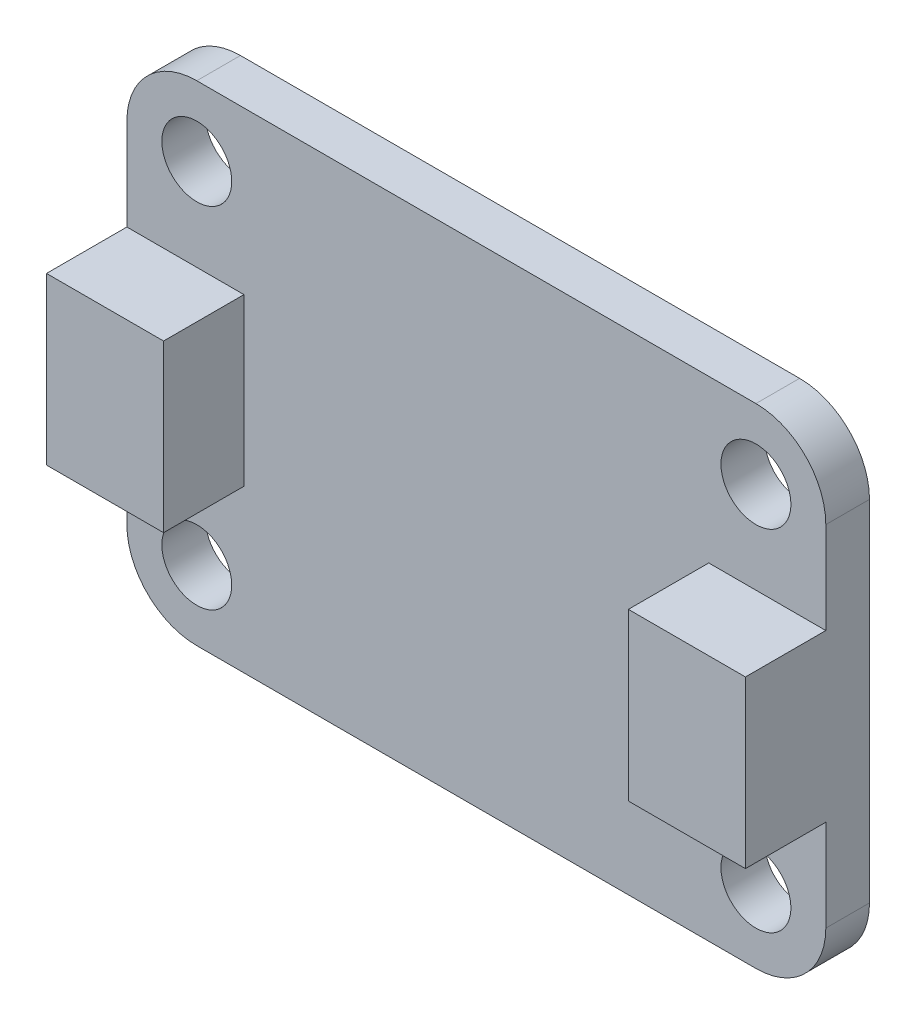
ISO-10303-21;
HEADER;
FILE_DESCRIPTION(('STEP AP214'),'2;1');
FILE_NAME('part.step','',(''),(''),'','','');
FILE_SCHEMA(('AUTOMOTIVE_DESIGN { 1 0 10303 214 1 1 1 1 }'));
ENDSEC;
DATA;
#1=APPLICATION_CONTEXT('core data for automotive mechanical design processes');
#2=APPLICATION_PROTOCOL_DEFINITION('international standard','automotive_design',2000,#1);
#3=PRODUCT_CONTEXT('',#1,'mechanical');
#4=PRODUCT('Part','Part','',(#3));
#5=PRODUCT_RELATED_PRODUCT_CATEGORY('part','',(#4));
#6=PRODUCT_DEFINITION_FORMATION('','',#4);
#7=PRODUCT_DEFINITION_CONTEXT('part definition',#1,'design');
#8=PRODUCT_DEFINITION('design','',#6,#7);
#9=PRODUCT_DEFINITION_SHAPE('','',#8);
#10=(LENGTH_UNIT() NAMED_UNIT(*) SI_UNIT(.MILLI.,.METRE.));
#11=(NAMED_UNIT(*) PLANE_ANGLE_UNIT() SI_UNIT($,.RADIAN.));
#12=(NAMED_UNIT(*) SI_UNIT($,.STERADIAN.) SOLID_ANGLE_UNIT());
#13=UNCERTAINTY_MEASURE_WITH_UNIT(LENGTH_MEASURE(1.E-05),#10,'distance_accuracy_value','');
#14=(GEOMETRIC_REPRESENTATION_CONTEXT(3) GLOBAL_UNCERTAINTY_ASSIGNED_CONTEXT((#13)) GLOBAL_UNIT_ASSIGNED_CONTEXT((#10,
#11,#12)) REPRESENTATION_CONTEXT('',''));
#15=CARTESIAN_POINT('',(0.,0.,0.));
#16=DIRECTION('',(0.,0.,1.));
#17=DIRECTION('',(1.,0.,0.));
#18=AXIS2_PLACEMENT_3D('',#15,#16,#17);
#19=CARTESIAN_POINT('',(0.,0.,0.79375));
#20=DIRECTION('',(0.,0.,1.));
#21=DIRECTION('',(1.,0.,0.));
#22=AXIS2_PLACEMENT_3D('',#19,#20,#21);
#23=PLANE('',#22);
#24=CARTESIAN_POINT('',(10.16,6.35,0.79375));
#25=DIRECTION('',(0.,0.,1.));
#26=DIRECTION('',(-1.,0.,0.));
#27=AXIS2_PLACEMENT_3D('',#24,#25,#26);
#28=CIRCLE('',#27,1.27);
#29=CARTESIAN_POINT('',(8.89,6.35,0.79375));
#30=VERTEX_POINT('',#29);
#31=EDGE_CURVE('E628',#30,#30,#28,.T.);
#32=ORIENTED_EDGE('',*,*,#31,.F.);
#33=EDGE_LOOP('',(#32));
#34=FACE_BOUND('',#33,.T.);
#35=CARTESIAN_POINT('',(10.16,-6.35,0.79375));
#36=DIRECTION('',(0.,0.,1.));
#37=DIRECTION('',(-1.,0.,0.));
#38=AXIS2_PLACEMENT_3D('',#35,#36,#37);
#39=CIRCLE('',#38,1.27);
#40=CARTESIAN_POINT('',(8.89,-6.35,0.79375));
#41=VERTEX_POINT('',#40);
#42=EDGE_CURVE('E636',#41,#41,#39,.T.);
#43=ORIENTED_EDGE('',*,*,#42,.F.);
#44=EDGE_LOOP('',(#43));
#45=FACE_BOUND('',#44,.T.);
#46=CARTESIAN_POINT('',(-10.16,-6.35,0.79375));
#47=DIRECTION('',(0.,0.,1.));
#48=DIRECTION('',(1.,0.,0.));
#49=AXIS2_PLACEMENT_3D('',#46,#47,#48);
#50=CIRCLE('',#49,1.27);
#51=CARTESIAN_POINT('',(-8.89,-6.35,0.79375));
#52=VERTEX_POINT('',#51);
#53=EDGE_CURVE('E622',#52,#52,#50,.T.);
#54=ORIENTED_EDGE('',*,*,#53,.F.);
#55=EDGE_LOOP('',(#54));
#56=FACE_BOUND('',#55,.T.);
#57=CARTESIAN_POINT('',(-10.16,6.35,0.79375));
#58=DIRECTION('',(0.,0.,1.));
#59=DIRECTION('',(1.,0.,0.));
#60=AXIS2_PLACEMENT_3D('',#57,#58,#59);
#61=CIRCLE('',#60,1.27);
#62=CARTESIAN_POINT('',(-8.89,6.35,0.79375));
#63=VERTEX_POINT('',#62);
#64=EDGE_CURVE('E617',#63,#63,#61,.T.);
#65=ORIENTED_EDGE('',*,*,#64,.F.);
#66=EDGE_LOOP('',(#65));
#67=FACE_BOUND('',#66,.T.);
#68=DIRECTION('',(0.,1.,0.));
#69=VECTOR('',#68,1.);
#70=CARTESIAN_POINT('',(12.7,8.89,0.79375));
#71=LINE('',#70,#69);
#72=CARTESIAN_POINT('',(12.7,3.01625,0.79375));
#73=VERTEX_POINT('',#72);
#74=CARTESIAN_POINT('',(12.7,6.35,0.79375));
#75=VERTEX_POINT('',#74);
#76=EDGE_CURVE('E256',#73,#75,#71,.T.);
#77=ORIENTED_EDGE('',*,*,#76,.T.);
#78=CARTESIAN_POINT('',(10.16,6.35,0.79375));
#79=DIRECTION('',(0.,0.,1.));
#80=DIRECTION('',(1.,0.,0.));
#81=AXIS2_PLACEMENT_3D('',#78,#79,#80);
#82=CIRCLE('',#81,2.54);
#83=CARTESIAN_POINT('',(10.16,8.89,0.79375));
#84=VERTEX_POINT('',#83);
#85=EDGE_CURVE('E308',#75,#84,#82,.T.);
#86=ORIENTED_EDGE('',*,*,#85,.T.);
#87=DIRECTION('',(-1.,0.,0.));
#88=VECTOR('',#87,1.);
#89=CARTESIAN_POINT('',(-12.7,8.89,0.79375));
#90=LINE('',#89,#88);
#91=CARTESIAN_POINT('',(-10.16,8.89,0.79375));
#92=VERTEX_POINT('',#91);
#93=EDGE_CURVE('E255',#84,#92,#90,.T.);
#94=ORIENTED_EDGE('',*,*,#93,.T.);
#95=CARTESIAN_POINT('',(-10.16,6.35,0.79375));
#96=DIRECTION('',(0.,0.,1.));
#97=DIRECTION('',(1.,0.,0.));
#98=AXIS2_PLACEMENT_3D('',#95,#96,#97);
#99=CIRCLE('',#98,2.54);
#100=CARTESIAN_POINT('',(-12.7,6.35,0.79375));
#101=VERTEX_POINT('',#100);
#102=EDGE_CURVE('E59',#92,#101,#99,.T.);
#103=ORIENTED_EDGE('',*,*,#102,.T.);
#104=DIRECTION('',(0.,-1.,0.));
#105=VECTOR('',#104,1.);
#106=CARTESIAN_POINT('',(-12.7,8.89,0.79375));
#107=LINE('',#106,#105);
#108=CARTESIAN_POINT('',(-12.7,3.01625,0.79375));
#109=VERTEX_POINT('',#108);
#110=EDGE_CURVE('E157',#101,#109,#107,.T.);
#111=ORIENTED_EDGE('',*,*,#110,.T.);
#112=DIRECTION('',(-1.,0.,0.));
#113=VECTOR('',#112,1.);
#114=CARTESIAN_POINT('',(-12.7,3.01625,0.79375));
#115=LINE('',#114,#113);
#116=CARTESIAN_POINT('',(-8.4455,3.01625,0.79375));
#117=VERTEX_POINT('',#116);
#118=EDGE_CURVE('E161',#117,#109,#115,.T.);
#119=ORIENTED_EDGE('',*,*,#118,.F.);
#120=DIRECTION('',(0.,1.,0.));
#121=VECTOR('',#120,1.);
#122=CARTESIAN_POINT('',(-8.4455,-3.01625,0.79375));
#123=LINE('',#122,#121);
#124=CARTESIAN_POINT('',(-8.4455,-3.01625,0.79375));
#125=VERTEX_POINT('',#124);
#126=EDGE_CURVE('E180',#125,#117,#123,.T.);
#127=ORIENTED_EDGE('',*,*,#126,.F.);
#128=DIRECTION('',(1.,0.,0.));
#129=VECTOR('',#128,1.);
#130=CARTESIAN_POINT('',(-12.7,-3.01625,0.79375));
#131=LINE('',#130,#129);
#132=CARTESIAN_POINT('',(-12.7,-3.01625,0.79375));
#133=VERTEX_POINT('',#132);
#134=EDGE_CURVE('E200',#133,#125,#131,.T.);
#135=ORIENTED_EDGE('',*,*,#134,.F.);
#136=CARTESIAN_POINT('',(-12.7,-6.35,0.79375));
#137=VERTEX_POINT('',#136);
#138=EDGE_CURVE('E168',#133,#137,#107,.T.);
#139=ORIENTED_EDGE('',*,*,#138,.T.);
#140=CARTESIAN_POINT('',(-10.16,-6.35,0.79375));
#141=DIRECTION('',(0.,0.,1.));
#142=DIRECTION('',(1.,0.,0.));
#143=AXIS2_PLACEMENT_3D('',#140,#141,#142);
#144=CIRCLE('',#143,2.54);
#145=CARTESIAN_POINT('',(-10.16,-8.89,0.79375));
#146=VERTEX_POINT('',#145);
#147=EDGE_CURVE('E302',#137,#146,#144,.T.);
#148=ORIENTED_EDGE('',*,*,#147,.T.);
#149=DIRECTION('',(1.,0.,0.));
#150=VECTOR('',#149,1.);
#151=CARTESIAN_POINT('',(-12.7,-8.89,0.79375));
#152=LINE('',#151,#150);
#153=CARTESIAN_POINT('',(10.16,-8.89,0.79375));
#154=VERTEX_POINT('',#153);
#155=EDGE_CURVE('E167',#146,#154,#152,.T.);
#156=ORIENTED_EDGE('',*,*,#155,.T.);
#157=CARTESIAN_POINT('',(10.16,-6.35,0.79375));
#158=DIRECTION('',(0.,0.,1.));
#159=DIRECTION('',(1.,0.,0.));
#160=AXIS2_PLACEMENT_3D('',#157,#158,#159);
#161=CIRCLE('',#160,2.54);
#162=CARTESIAN_POINT('',(12.7,-6.35,0.79375));
#163=VERTEX_POINT('',#162);
#164=EDGE_CURVE('E305',#154,#163,#161,.T.);
#165=ORIENTED_EDGE('',*,*,#164,.T.);
#166=CARTESIAN_POINT('',(12.7,-3.01625,0.79375));
#167=VERTEX_POINT('',#166);
#168=EDGE_CURVE('E252',#163,#167,#71,.T.);
#169=ORIENTED_EDGE('',*,*,#168,.T.);
#170=DIRECTION('',(1.,0.,0.));
#171=VECTOR('',#170,1.);
#172=CARTESIAN_POINT('',(12.7,-3.01625,0.79375));
#173=LINE('',#172,#171);
#174=CARTESIAN_POINT('',(8.4455,-3.01625,0.79375));
#175=VERTEX_POINT('',#174);
#176=EDGE_CURVE('E216',#175,#167,#173,.T.);
#177=ORIENTED_EDGE('',*,*,#176,.F.);
#178=DIRECTION('',(0.,-1.,0.));
#179=VECTOR('',#178,1.);
#180=CARTESIAN_POINT('',(8.4455,-3.01625,0.79375));
#181=LINE('',#180,#179);
#182=CARTESIAN_POINT('',(8.4455,3.01625,0.79375));
#183=VERTEX_POINT('',#182);
#184=EDGE_CURVE('E229',#183,#175,#181,.T.);
#185=ORIENTED_EDGE('',*,*,#184,.F.);
#186=DIRECTION('',(-1.,0.,0.));
#187=VECTOR('',#186,1.);
#188=CARTESIAN_POINT('',(12.7,3.01625,0.79375));
#189=LINE('',#188,#187);
#190=EDGE_CURVE('E202',#73,#183,#189,.T.);
#191=ORIENTED_EDGE('',*,*,#190,.F.);
#192=EDGE_LOOP('',(#77,#86,#94,#103,#111,#119,#127,#135,#139,#148,#156,#165,#169,#177,#185,#191));
#193=FACE_BOUND('',#192,.T.);
#194=ADVANCED_FACE('F43',(#34,#45,#56,#67,#193),#23,.T.);
#195=CARTESIAN_POINT('',(12.7,8.89,0.79375));
#196=DIRECTION('',(-1.,0.,0.));
#197=DIRECTION('',(0.,-1.,0.));
#198=AXIS2_PLACEMENT_3D('',#195,#196,#197);
#199=PLANE('',#198);
#200=DIRECTION('',(0.,1.,0.));
#201=VECTOR('',#200,1.);
#202=CARTESIAN_POINT('',(12.7,8.89,-0.79375));
#203=LINE('',#202,#201);
#204=CARTESIAN_POINT('',(12.7,-6.35,-0.79375));
#205=VERTEX_POINT('',#204);
#206=CARTESIAN_POINT('',(12.7,6.35,-0.79375));
#207=VERTEX_POINT('',#206);
#208=EDGE_CURVE('E251',#205,#207,#203,.T.);
#209=ORIENTED_EDGE('',*,*,#208,.T.);
#210=DIRECTION('',(0.,0.,-1.));
#211=VECTOR('',#210,1.);
#212=CARTESIAN_POINT('',(12.7,6.35,0.79375));
#213=LINE('',#212,#211);
#214=EDGE_CURVE('E297',#207,#75,#213,.F.);
#215=ORIENTED_EDGE('',*,*,#214,.T.);
#216=ORIENTED_EDGE('',*,*,#76,.F.);
#217=DIRECTION('',(0.,0.,-1.));
#218=VECTOR('',#217,1.);
#219=CARTESIAN_POINT('',(12.7,3.01625,3.71475));
#220=LINE('',#219,#218);
#221=CARTESIAN_POINT('',(12.7,3.01625,3.71475));
#222=VERTEX_POINT('',#221);
#223=EDGE_CURVE('E247',#222,#73,#220,.T.);
#224=ORIENTED_EDGE('',*,*,#223,.F.);
#225=DIRECTION('',(0.,1.,0.));
#226=VECTOR('',#225,1.);
#227=CARTESIAN_POINT('',(12.7,-3.01625,3.71475));
#228=LINE('',#227,#226);
#229=CARTESIAN_POINT('',(12.7,-3.01625,3.71475));
#230=VERTEX_POINT('',#229);
#231=EDGE_CURVE('E211',#230,#222,#228,.T.);
#232=ORIENTED_EDGE('',*,*,#231,.F.);
#233=DIRECTION('',(0.,0.,-1.));
#234=VECTOR('',#233,1.);
#235=CARTESIAN_POINT('',(12.7,-3.01625,3.71475));
#236=LINE('',#235,#234);
#237=EDGE_CURVE('E225',#230,#167,#236,.T.);
#238=ORIENTED_EDGE('',*,*,#237,.T.);
#239=ORIENTED_EDGE('',*,*,#168,.F.);
#240=DIRECTION('',(0.,0.,-1.));
#241=VECTOR('',#240,1.);
#242=CARTESIAN_POINT('',(12.7,-6.35,0.79375));
#243=LINE('',#242,#241);
#244=EDGE_CURVE('E293',#163,#205,#243,.T.);
#245=ORIENTED_EDGE('',*,*,#244,.T.);
#246=EDGE_LOOP('',(#209,#215,#216,#224,#232,#238,#239,#245));
#247=FACE_BOUND('',#246,.T.);
#248=ADVANCED_FACE('F337',(#247),#199,.F.);
#249=CARTESIAN_POINT('',(-12.7,8.89,0.79375));
#250=DIRECTION('',(0.,-1.,0.));
#251=DIRECTION('',(0.,0.,-1.));
#252=AXIS2_PLACEMENT_3D('',#249,#250,#251);
#253=PLANE('',#252);
#254=ORIENTED_EDGE('',*,*,#93,.F.);
#255=DIRECTION('',(0.,0.,-1.));
#256=VECTOR('',#255,1.);
#257=CARTESIAN_POINT('',(10.16,8.89,0.79375));
#258=LINE('',#257,#256);
#259=CARTESIAN_POINT('',(10.16,8.89,-0.79375));
#260=VERTEX_POINT('',#259);
#261=EDGE_CURVE('E277',#84,#260,#258,.T.);
#262=ORIENTED_EDGE('',*,*,#261,.T.);
#263=DIRECTION('',(-1.,0.,0.));
#264=VECTOR('',#263,1.);
#265=CARTESIAN_POINT('',(-12.7,8.89,-0.79375));
#266=LINE('',#265,#264);
#267=CARTESIAN_POINT('',(-10.16,8.89,-0.79375));
#268=VERTEX_POINT('',#267);
#269=EDGE_CURVE('E265',#260,#268,#266,.T.);
#270=ORIENTED_EDGE('',*,*,#269,.T.);
#271=DIRECTION('',(0.,0.,-1.));
#272=VECTOR('',#271,1.);
#273=CARTESIAN_POINT('',(-10.16,8.89,0.79375));
#274=LINE('',#273,#272);
#275=EDGE_CURVE('E261',#268,#92,#274,.F.);
#276=ORIENTED_EDGE('',*,*,#275,.T.);
#277=EDGE_LOOP('',(#254,#262,#270,#276));
#278=FACE_BOUND('',#277,.T.);
#279=ADVANCED_FACE('F345',(#278),#253,.F.);
#280=CARTESIAN_POINT('',(-12.7,8.89,0.79375));
#281=DIRECTION('',(1.,0.,0.));
#282=DIRECTION('',(0.,1.,0.));
#283=AXIS2_PLACEMENT_3D('',#280,#281,#282);
#284=PLANE('',#283);
#285=DIRECTION('',(0.,-1.,0.));
#286=VECTOR('',#285,1.);
#287=CARTESIAN_POINT('',(-12.7,8.89,-0.79375));
#288=LINE('',#287,#286);
#289=CARTESIAN_POINT('',(-12.7,6.35,-0.79375));
#290=VERTEX_POINT('',#289);
#291=CARTESIAN_POINT('',(-12.7,-6.35,-0.79375));
#292=VERTEX_POINT('',#291);
#293=EDGE_CURVE('E269',#290,#292,#288,.T.);
#294=ORIENTED_EDGE('',*,*,#293,.T.);
#295=DIRECTION('',(0.,0.,-1.));
#296=VECTOR('',#295,1.);
#297=CARTESIAN_POINT('',(-12.7,-6.35,0.79375));
#298=LINE('',#297,#296);
#299=EDGE_CURVE('E11',#292,#137,#298,.F.);
#300=ORIENTED_EDGE('',*,*,#299,.T.);
#301=ORIENTED_EDGE('',*,*,#138,.F.);
#302=DIRECTION('',(0.,0.,-1.));
#303=VECTOR('',#302,1.);
#304=CARTESIAN_POINT('',(-12.7,-3.01625,3.71475));
#305=LINE('',#304,#303);
#306=CARTESIAN_POINT('',(-12.7,-3.01625,3.71475));
#307=VERTEX_POINT('',#306);
#308=EDGE_CURVE('E609',#307,#133,#305,.T.);
#309=ORIENTED_EDGE('',*,*,#308,.F.);
#310=DIRECTION('',(0.,-1.,0.));
#311=VECTOR('',#310,1.);
#312=CARTESIAN_POINT('',(-12.7,-3.01625,3.71475));
#313=LINE('',#312,#311);
#314=CARTESIAN_POINT('',(-12.7,3.01625,3.71475));
#315=VERTEX_POINT('',#314);
#316=EDGE_CURVE('E181',#315,#307,#313,.T.);
#317=ORIENTED_EDGE('',*,*,#316,.F.);
#318=DIRECTION('',(0.,0.,-1.));
#319=VECTOR('',#318,1.);
#320=CARTESIAN_POINT('',(-12.7,3.01625,3.71475));
#321=LINE('',#320,#319);
#322=EDGE_CURVE('E174',#315,#109,#321,.T.);
#323=ORIENTED_EDGE('',*,*,#322,.T.);
#324=ORIENTED_EDGE('',*,*,#110,.F.);
#325=DIRECTION('',(0.,0.,-1.));
#326=VECTOR('',#325,1.);
#327=CARTESIAN_POINT('',(-12.7,6.35,0.79375));
#328=LINE('',#327,#326);
#329=EDGE_CURVE('E52',#101,#290,#328,.T.);
#330=ORIENTED_EDGE('',*,*,#329,.T.);
#331=EDGE_LOOP('',(#294,#300,#301,#309,#317,#323,#324,#330));
#332=FACE_BOUND('',#331,.T.);
#333=ADVANCED_FACE('F184',(#332),#284,.F.);
#334=CARTESIAN_POINT('',(-12.7,-8.89,0.79375));
#335=DIRECTION('',(0.,1.,0.));
#336=DIRECTION('',(0.,0.,1.));
#337=AXIS2_PLACEMENT_3D('',#334,#335,#336);
#338=PLANE('',#337);
#339=DIRECTION('',(1.,0.,0.));
#340=VECTOR('',#339,1.);
#341=CARTESIAN_POINT('',(-12.7,-8.89,-0.79375));
#342=LINE('',#341,#340);
#343=CARTESIAN_POINT('',(-10.16,-8.89,-0.79375));
#344=VERTEX_POINT('',#343);
#345=CARTESIAN_POINT('',(10.16,-8.89,-0.79375));
#346=VERTEX_POINT('',#345);
#347=EDGE_CURVE('E272',#344,#346,#342,.T.);
#348=ORIENTED_EDGE('',*,*,#347,.T.);
#349=DIRECTION('',(0.,0.,-1.));
#350=VECTOR('',#349,1.);
#351=CARTESIAN_POINT('',(10.16,-8.89,0.79375));
#352=LINE('',#351,#350);
#353=EDGE_CURVE('E67',#346,#154,#352,.F.);
#354=ORIENTED_EDGE('',*,*,#353,.T.);
#355=ORIENTED_EDGE('',*,*,#155,.F.);
#356=DIRECTION('',(0.,0.,-1.));
#357=VECTOR('',#356,1.);
#358=CARTESIAN_POINT('',(-10.16,-8.89,0.79375));
#359=LINE('',#358,#357);
#360=EDGE_CURVE('E311',#146,#344,#359,.T.);
#361=ORIENTED_EDGE('',*,*,#360,.T.);
#362=EDGE_LOOP('',(#348,#354,#355,#361));
#363=FACE_BOUND('',#362,.T.);
#364=ADVANCED_FACE('F328',(#363),#338,.F.);
#365=CARTESIAN_POINT('',(0.,0.,-0.79375));
#366=DIRECTION('',(0.,0.,1.));
#367=DIRECTION('',(1.,0.,0.));
#368=AXIS2_PLACEMENT_3D('',#365,#366,#367);
#369=PLANE('',#368);
#370=CARTESIAN_POINT('',(10.16,6.35,-0.79375));
#371=DIRECTION('',(0.,0.,1.));
#372=DIRECTION('',(-1.,0.,0.));
#373=AXIS2_PLACEMENT_3D('',#370,#371,#372);
#374=CIRCLE('',#373,1.27);
#375=CARTESIAN_POINT('',(8.89,6.35,-0.79375));
#376=VERTEX_POINT('',#375);
#377=EDGE_CURVE('E624',#376,#376,#374,.T.);
#378=ORIENTED_EDGE('',*,*,#377,.T.);
#379=EDGE_LOOP('',(#378));
#380=FACE_BOUND('',#379,.T.);
#381=CARTESIAN_POINT('',(10.16,-6.35,-0.79375));
#382=DIRECTION('',(0.,0.,1.));
#383=DIRECTION('',(-1.,0.,0.));
#384=AXIS2_PLACEMENT_3D('',#381,#382,#383);
#385=CIRCLE('',#384,1.27);
#386=CARTESIAN_POINT('',(8.89,-6.35,-0.79375));
#387=VERTEX_POINT('',#386);
#388=EDGE_CURVE('E632',#387,#387,#385,.T.);
#389=ORIENTED_EDGE('',*,*,#388,.T.);
#390=EDGE_LOOP('',(#389));
#391=FACE_BOUND('',#390,.T.);
#392=CARTESIAN_POINT('',(-10.16,-6.35,-0.79375));
#393=DIRECTION('',(0.,0.,1.));
#394=DIRECTION('',(1.,0.,0.));
#395=AXIS2_PLACEMENT_3D('',#392,#393,#394);
#396=CIRCLE('',#395,1.27);
#397=CARTESIAN_POINT('',(-8.89,-6.35,-0.79375));
#398=VERTEX_POINT('',#397);
#399=EDGE_CURVE('E640',#398,#398,#396,.T.);
#400=ORIENTED_EDGE('',*,*,#399,.T.);
#401=EDGE_LOOP('',(#400));
#402=FACE_BOUND('',#401,.T.);
#403=CARTESIAN_POINT('',(-10.16,6.35,-0.79375));
#404=DIRECTION('',(0.,0.,1.));
#405=DIRECTION('',(1.,0.,0.));
#406=AXIS2_PLACEMENT_3D('',#403,#404,#405);
#407=CIRCLE('',#406,1.27);
#408=CARTESIAN_POINT('',(-8.89,6.35,-0.79375));
#409=VERTEX_POINT('',#408);
#410=EDGE_CURVE('E611',#409,#409,#407,.T.);
#411=ORIENTED_EDGE('',*,*,#410,.T.);
#412=EDGE_LOOP('',(#411));
#413=FACE_BOUND('',#412,.T.);
#414=ORIENTED_EDGE('',*,*,#269,.F.);
#415=CARTESIAN_POINT('',(10.16,6.35,-0.79375));
#416=DIRECTION('',(0.,0.,1.));
#417=DIRECTION('',(1.,0.,0.));
#418=AXIS2_PLACEMENT_3D('',#415,#416,#417);
#419=CIRCLE('',#418,2.54);
#420=EDGE_CURVE('E290',#260,#207,#419,.F.);
#421=ORIENTED_EDGE('',*,*,#420,.T.);
#422=ORIENTED_EDGE('',*,*,#208,.F.);
#423=CARTESIAN_POINT('',(10.16,-6.35,-0.79375));
#424=DIRECTION('',(0.,0.,1.));
#425=DIRECTION('',(1.,0.,0.));
#426=AXIS2_PLACEMENT_3D('',#423,#424,#425);
#427=CIRCLE('',#426,2.54);
#428=EDGE_CURVE('E287',#205,#346,#427,.F.);
#429=ORIENTED_EDGE('',*,*,#428,.T.);
#430=ORIENTED_EDGE('',*,*,#347,.F.);
#431=CARTESIAN_POINT('',(-10.16,-6.35,-0.79375));
#432=DIRECTION('',(0.,0.,1.));
#433=DIRECTION('',(1.,0.,0.));
#434=AXIS2_PLACEMENT_3D('',#431,#432,#433);
#435=CIRCLE('',#434,2.54);
#436=EDGE_CURVE('E284',#344,#292,#435,.F.);
#437=ORIENTED_EDGE('',*,*,#436,.T.);
#438=ORIENTED_EDGE('',*,*,#293,.F.);
#439=CARTESIAN_POINT('',(-10.16,6.35,-0.79375));
#440=DIRECTION('',(0.,0.,1.));
#441=DIRECTION('',(1.,0.,0.));
#442=AXIS2_PLACEMENT_3D('',#439,#440,#441);
#443=CIRCLE('',#442,2.54);
#444=EDGE_CURVE('E281',#290,#268,#443,.F.);
#445=ORIENTED_EDGE('',*,*,#444,.T.);
#446=EDGE_LOOP('',(#414,#421,#422,#429,#430,#437,#438,#445));
#447=FACE_BOUND('',#446,.T.);
#448=ADVANCED_FACE('F322',(#380,#391,#402,#413,#447),#369,.F.);
#449=CARTESIAN_POINT('',(12.7,3.01625,3.71475));
#450=DIRECTION('',(0.,-1.,0.));
#451=DIRECTION('',(1.,0.,0.));
#452=AXIS2_PLACEMENT_3D('',#449,#450,#451);
#453=PLANE('',#452);
#454=ORIENTED_EDGE('',*,*,#190,.T.);
#455=DIRECTION('',(0.,0.,-1.));
#456=VECTOR('',#455,1.);
#457=CARTESIAN_POINT('',(8.4455,3.01625,3.71475));
#458=LINE('',#457,#456);
#459=CARTESIAN_POINT('',(8.4455,3.01625,3.71475));
#460=VERTEX_POINT('',#459);
#461=EDGE_CURVE('E243',#460,#183,#458,.T.);
#462=ORIENTED_EDGE('',*,*,#461,.F.);
#463=DIRECTION('',(-1.,0.,0.));
#464=VECTOR('',#463,1.);
#465=CARTESIAN_POINT('',(12.7,3.01625,3.71475));
#466=LINE('',#465,#464);
#467=EDGE_CURVE('E215',#222,#460,#466,.T.);
#468=ORIENTED_EDGE('',*,*,#467,.F.);
#469=ORIENTED_EDGE('',*,*,#223,.T.);
#470=EDGE_LOOP('',(#454,#462,#468,#469));
#471=FACE_BOUND('',#470,.T.);
#472=ADVANCED_FACE('F362',(#471),#453,.F.);
#473=CARTESIAN_POINT('',(8.4455,-3.01625,3.71475));
#474=DIRECTION('',(1.,0.,0.));
#475=DIRECTION('',(0.,0.,-1.));
#476=AXIS2_PLACEMENT_3D('',#473,#474,#475);
#477=PLANE('',#476);
#478=ORIENTED_EDGE('',*,*,#184,.T.);
#479=DIRECTION('',(0.,0.,-1.));
#480=VECTOR('',#479,1.);
#481=CARTESIAN_POINT('',(8.4455,-3.01625,3.71475));
#482=LINE('',#481,#480);
#483=CARTESIAN_POINT('',(8.4455,-3.01625,3.71475));
#484=VERTEX_POINT('',#483);
#485=EDGE_CURVE('E239',#484,#175,#482,.T.);
#486=ORIENTED_EDGE('',*,*,#485,.F.);
#487=DIRECTION('',(0.,-1.,0.));
#488=VECTOR('',#487,1.);
#489=CARTESIAN_POINT('',(8.4455,-3.01625,3.71475));
#490=LINE('',#489,#488);
#491=EDGE_CURVE('E219',#460,#484,#490,.T.);
#492=ORIENTED_EDGE('',*,*,#491,.F.);
#493=ORIENTED_EDGE('',*,*,#461,.T.);
#494=EDGE_LOOP('',(#478,#486,#492,#493));
#495=FACE_BOUND('',#494,.T.);
#496=ADVANCED_FACE('F499',(#495),#477,.F.);
#497=CARTESIAN_POINT('',(12.7,-3.01625,3.71475));
#498=DIRECTION('',(0.,1.,0.));
#499=DIRECTION('',(-1.,0.,0.));
#500=AXIS2_PLACEMENT_3D('',#497,#498,#499);
#501=PLANE('',#500);
#502=ORIENTED_EDGE('',*,*,#176,.T.);
#503=ORIENTED_EDGE('',*,*,#237,.F.);
#504=DIRECTION('',(1.,0.,0.));
#505=VECTOR('',#504,1.);
#506=CARTESIAN_POINT('',(12.7,-3.01625,3.71475));
#507=LINE('',#506,#505);
#508=EDGE_CURVE('E222',#484,#230,#507,.T.);
#509=ORIENTED_EDGE('',*,*,#508,.F.);
#510=ORIENTED_EDGE('',*,*,#485,.T.);
#511=EDGE_LOOP('',(#502,#503,#509,#510));
#512=FACE_BOUND('',#511,.T.);
#513=ADVANCED_FACE('F489',(#512),#501,.F.);
#514=CARTESIAN_POINT('',(0.,0.,3.71475));
#515=DIRECTION('',(0.,0.,1.));
#516=DIRECTION('',(1.,0.,0.));
#517=AXIS2_PLACEMENT_3D('',#514,#515,#516);
#518=PLANE('',#517);
#519=ORIENTED_EDGE('',*,*,#231,.T.);
#520=ORIENTED_EDGE('',*,*,#467,.T.);
#521=ORIENTED_EDGE('',*,*,#491,.T.);
#522=ORIENTED_EDGE('',*,*,#508,.T.);
#523=EDGE_LOOP('',(#519,#520,#521,#522));
#524=FACE_BOUND('',#523,.T.);
#525=ADVANCED_FACE('F479',(#524),#518,.T.);
#526=CARTESIAN_POINT('',(-12.7,-3.01625,3.71475));
#527=DIRECTION('',(0.,1.,0.));
#528=DIRECTION('',(-1.,0.,0.));
#529=AXIS2_PLACEMENT_3D('',#526,#527,#528);
#530=PLANE('',#529);
#531=ORIENTED_EDGE('',*,*,#134,.T.);
#532=DIRECTION('',(0.,0.,-1.));
#533=VECTOR('',#532,1.);
#534=CARTESIAN_POINT('',(-8.4455,-3.01625,3.71475));
#535=LINE('',#534,#533);
#536=CARTESIAN_POINT('',(-8.4455,-3.01625,3.71475));
#537=VERTEX_POINT('',#536);
#538=EDGE_CURVE('E194',#537,#125,#535,.T.);
#539=ORIENTED_EDGE('',*,*,#538,.F.);
#540=DIRECTION('',(1.,0.,0.));
#541=VECTOR('',#540,1.);
#542=CARTESIAN_POINT('',(-12.7,-3.01625,3.71475));
#543=LINE('',#542,#541);
#544=EDGE_CURVE('E206',#307,#537,#543,.T.);
#545=ORIENTED_EDGE('',*,*,#544,.F.);
#546=ORIENTED_EDGE('',*,*,#308,.T.);
#547=EDGE_LOOP('',(#531,#539,#545,#546));
#548=FACE_BOUND('',#547,.T.);
#549=ADVANCED_FACE('F469',(#548),#530,.F.);
#550=CARTESIAN_POINT('',(-8.4455,-3.01625,3.71475));
#551=DIRECTION('',(-1.,0.,0.));
#552=DIRECTION('',(0.,0.,1.));
#553=AXIS2_PLACEMENT_3D('',#550,#551,#552);
#554=PLANE('',#553);
#555=ORIENTED_EDGE('',*,*,#126,.T.);
#556=DIRECTION('',(0.,0.,-1.));
#557=VECTOR('',#556,1.);
#558=CARTESIAN_POINT('',(-8.4455,3.01625,3.71475));
#559=LINE('',#558,#557);
#560=CARTESIAN_POINT('',(-8.4455,3.01625,3.71475));
#561=VERTEX_POINT('',#560);
#562=EDGE_CURVE('E177',#561,#117,#559,.T.);
#563=ORIENTED_EDGE('',*,*,#562,.F.);
#564=DIRECTION('',(0.,1.,0.));
#565=VECTOR('',#564,1.);
#566=CARTESIAN_POINT('',(-8.4455,-3.01625,3.71475));
#567=LINE('',#566,#565);
#568=EDGE_CURVE('E192',#537,#561,#567,.T.);
#569=ORIENTED_EDGE('',*,*,#568,.F.);
#570=ORIENTED_EDGE('',*,*,#538,.T.);
#571=EDGE_LOOP('',(#555,#563,#569,#570));
#572=FACE_BOUND('',#571,.T.);
#573=ADVANCED_FACE('F460',(#572),#554,.F.);
#574=CARTESIAN_POINT('',(-12.7,3.01625,3.71475));
#575=DIRECTION('',(0.,-1.,0.));
#576=DIRECTION('',(1.,0.,0.));
#577=AXIS2_PLACEMENT_3D('',#574,#575,#576);
#578=PLANE('',#577);
#579=ORIENTED_EDGE('',*,*,#118,.T.);
#580=ORIENTED_EDGE('',*,*,#322,.F.);
#581=DIRECTION('',(-1.,0.,0.));
#582=VECTOR('',#581,1.);
#583=CARTESIAN_POINT('',(-12.7,3.01625,3.71475));
#584=LINE('',#583,#582);
#585=EDGE_CURVE('E188',#561,#315,#584,.T.);
#586=ORIENTED_EDGE('',*,*,#585,.F.);
#587=ORIENTED_EDGE('',*,*,#562,.T.);
#588=EDGE_LOOP('',(#579,#580,#586,#587));
#589=FACE_BOUND('',#588,.T.);
#590=ADVANCED_FACE('F172',(#589),#578,.F.);
#591=CARTESIAN_POINT('',(0.,0.,3.71475));
#592=DIRECTION('',(0.,0.,-1.));
#593=DIRECTION('',(-1.,0.,0.));
#594=AXIS2_PLACEMENT_3D('',#591,#592,#593);
#595=PLANE('',#594);
#596=ORIENTED_EDGE('',*,*,#316,.T.);
#597=ORIENTED_EDGE('',*,*,#544,.T.);
#598=ORIENTED_EDGE('',*,*,#568,.T.);
#599=ORIENTED_EDGE('',*,*,#585,.T.);
#600=EDGE_LOOP('',(#596,#597,#598,#599));
#601=FACE_BOUND('',#600,.T.);
#602=ADVANCED_FACE('F441',(#601),#595,.F.);
#603=CARTESIAN_POINT('',(-10.16,6.35,-0.79375));
#604=DIRECTION('',(0.,0.,1.));
#605=DIRECTION('',(1.,0.,0.));
#606=AXIS2_PLACEMENT_3D('',#603,#604,#605);
#607=CYLINDRICAL_SURFACE('',#606,1.27);
#608=ORIENTED_EDGE('',*,*,#410,.F.);
#609=EDGE_LOOP('',(#608));
#610=FACE_BOUND('',#609,.T.);
#611=ORIENTED_EDGE('',*,*,#64,.T.);
#612=EDGE_LOOP('',(#611));
#613=FACE_BOUND('',#612,.T.);
#614=ADVANCED_FACE('F431',(#610,#613),#607,.F.);
#615=CARTESIAN_POINT('',(-10.16,-6.35,-0.79375));
#616=DIRECTION('',(0.,0.,1.));
#617=DIRECTION('',(1.,0.,0.));
#618=AXIS2_PLACEMENT_3D('',#615,#616,#617);
#619=CYLINDRICAL_SURFACE('',#618,1.27);
#620=ORIENTED_EDGE('',*,*,#399,.F.);
#621=EDGE_LOOP('',(#620));
#622=FACE_BOUND('',#621,.T.);
#623=ORIENTED_EDGE('',*,*,#53,.T.);
#624=EDGE_LOOP('',(#623));
#625=FACE_BOUND('',#624,.T.);
#626=ADVANCED_FACE('F421',(#622,#625),#619,.F.);
#627=CARTESIAN_POINT('',(10.16,-6.35,-0.79375));
#628=DIRECTION('',(0.,0.,1.));
#629=DIRECTION('',(1.,0.,0.));
#630=AXIS2_PLACEMENT_3D('',#627,#628,#629);
#631=CYLINDRICAL_SURFACE('',#630,1.27);
#632=ORIENTED_EDGE('',*,*,#388,.F.);
#633=EDGE_LOOP('',(#632));
#634=FACE_BOUND('',#633,.T.);
#635=ORIENTED_EDGE('',*,*,#42,.T.);
#636=EDGE_LOOP('',(#635));
#637=FACE_BOUND('',#636,.T.);
#638=ADVANCED_FACE('F411',(#634,#637),#631,.F.);
#639=CARTESIAN_POINT('',(10.16,6.35,-0.79375));
#640=DIRECTION('',(0.,0.,1.));
#641=DIRECTION('',(1.,0.,0.));
#642=AXIS2_PLACEMENT_3D('',#639,#640,#641);
#643=CYLINDRICAL_SURFACE('',#642,1.27);
#644=ORIENTED_EDGE('',*,*,#377,.F.);
#645=EDGE_LOOP('',(#644));
#646=FACE_BOUND('',#645,.T.);
#647=ORIENTED_EDGE('',*,*,#31,.T.);
#648=EDGE_LOOP('',(#647));
#649=FACE_BOUND('',#648,.T.);
#650=ADVANCED_FACE('F375',(#646,#649),#643,.F.);
#651=CARTESIAN_POINT('',(10.16,6.35,0.79375));
#652=DIRECTION('',(0.,0.,-1.));
#653=DIRECTION('',(-1.,0.,0.));
#654=AXIS2_PLACEMENT_3D('',#651,#652,#653);
#655=CYLINDRICAL_SURFACE('',#654,2.54);
#656=ORIENTED_EDGE('',*,*,#85,.F.);
#657=ORIENTED_EDGE('',*,*,#214,.F.);
#658=ORIENTED_EDGE('',*,*,#420,.F.);
#659=ORIENTED_EDGE('',*,*,#261,.F.);
#660=EDGE_LOOP('',(#656,#657,#658,#659));
#661=FACE_BOUND('',#660,.T.);
#662=ADVANCED_FACE('F342',(#661),#655,.T.);
#663=CARTESIAN_POINT('',(10.16,-6.35,0.79375));
#664=DIRECTION('',(0.,0.,-1.));
#665=DIRECTION('',(-1.,0.,0.));
#666=AXIS2_PLACEMENT_3D('',#663,#664,#665);
#667=CYLINDRICAL_SURFACE('',#666,2.54);
#668=ORIENTED_EDGE('',*,*,#164,.F.);
#669=ORIENTED_EDGE('',*,*,#353,.F.);
#670=ORIENTED_EDGE('',*,*,#428,.F.);
#671=ORIENTED_EDGE('',*,*,#244,.F.);
#672=EDGE_LOOP('',(#668,#669,#670,#671));
#673=FACE_BOUND('',#672,.T.);
#674=ADVANCED_FACE('F334',(#673),#667,.T.);
#675=CARTESIAN_POINT('',(-10.16,-6.35,0.79375));
#676=DIRECTION('',(0.,0.,-1.));
#677=DIRECTION('',(-1.,0.,0.));
#678=AXIS2_PLACEMENT_3D('',#675,#676,#677);
#679=CYLINDRICAL_SURFACE('',#678,2.54);
#680=ORIENTED_EDGE('',*,*,#147,.F.);
#681=ORIENTED_EDGE('',*,*,#299,.F.);
#682=ORIENTED_EDGE('',*,*,#436,.F.);
#683=ORIENTED_EDGE('',*,*,#360,.F.);
#684=EDGE_LOOP('',(#680,#681,#682,#683));
#685=FACE_BOUND('',#684,.T.);
#686=ADVANCED_FACE('F327',(#685),#679,.T.);
#687=CARTESIAN_POINT('',(-10.16,6.35,0.79375));
#688=DIRECTION('',(0.,0.,-1.));
#689=DIRECTION('',(-1.,0.,0.));
#690=AXIS2_PLACEMENT_3D('',#687,#688,#689);
#691=CYLINDRICAL_SURFACE('',#690,2.54);
#692=ORIENTED_EDGE('',*,*,#102,.F.);
#693=ORIENTED_EDGE('',*,*,#275,.F.);
#694=ORIENTED_EDGE('',*,*,#444,.F.);
#695=ORIENTED_EDGE('',*,*,#329,.F.);
#696=EDGE_LOOP('',(#692,#693,#694,#695));
#697=FACE_BOUND('',#696,.T.);
#698=ADVANCED_FACE('F45',(#697),#691,.T.);
#699=CLOSED_SHELL('',(#194,#248,#279,#333,#364,#448,#472,#496,#513,#525,#549,#573,#590,#602,
#614,#626,#638,#650,#662,#674,#686,#698));
#700=MANIFOLD_SOLID_BREP('B2',#699);
#701=ADVANCED_BREP_SHAPE_REPRESENTATION('',(#18,#700),#14);
#702=SHAPE_DEFINITION_REPRESENTATION(#9,#701);
ENDSEC;
END-ISO-10303-21;
